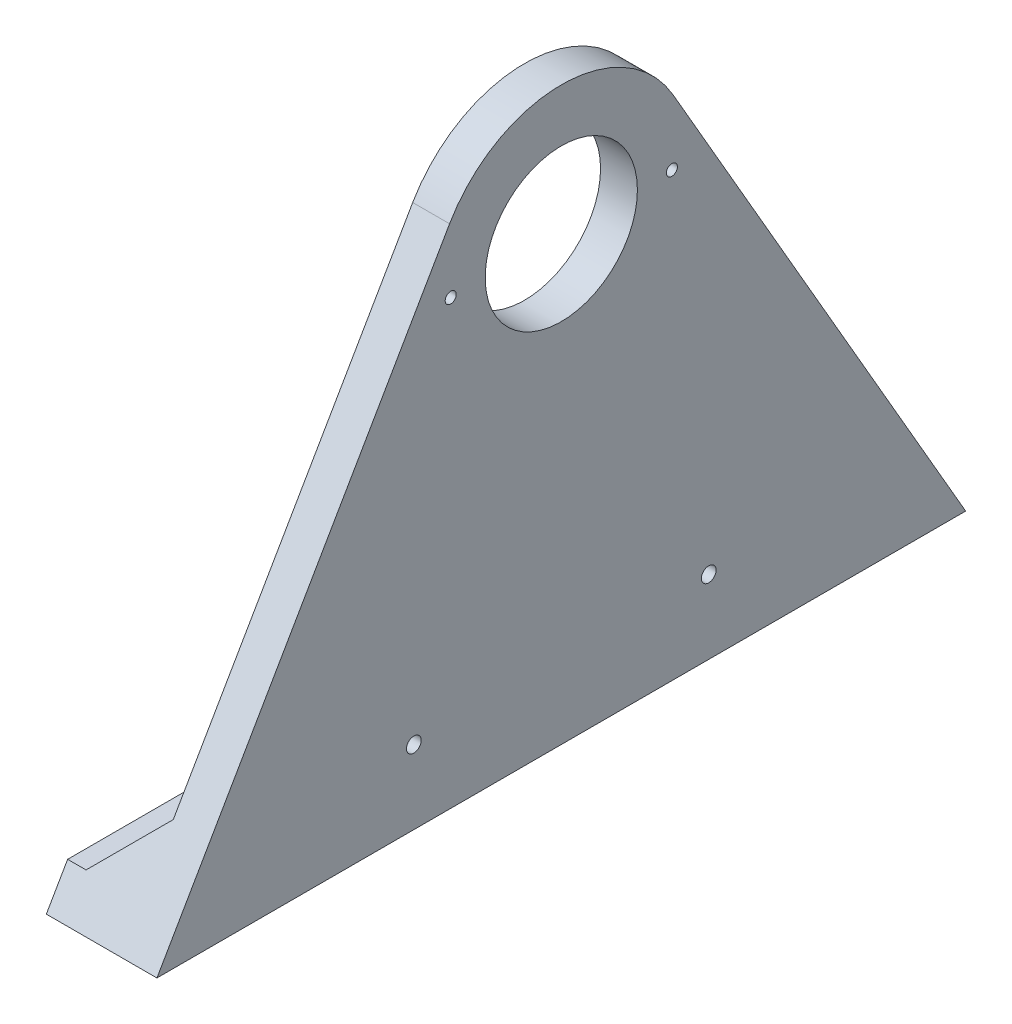
ISO-10303-21;
HEADER;
FILE_DESCRIPTION(('STEP AP214'),'2;1');
FILE_NAME('part.step','',(''),(''),'','','');
FILE_SCHEMA(('AUTOMOTIVE_DESIGN { 1 0 10303 214 1 1 1 1 }'));
ENDSEC;
DATA;
#1=APPLICATION_CONTEXT('core data for automotive mechanical design processes');
#2=APPLICATION_PROTOCOL_DEFINITION('international standard','automotive_design',2000,#1);
#3=PRODUCT_CONTEXT('',#1,'mechanical');
#4=PRODUCT('Part','Part','',(#3));
#5=PRODUCT_RELATED_PRODUCT_CATEGORY('part','',(#4));
#6=PRODUCT_DEFINITION_FORMATION('','',#4);
#7=PRODUCT_DEFINITION_CONTEXT('part definition',#1,'design');
#8=PRODUCT_DEFINITION('design','',#6,#7);
#9=PRODUCT_DEFINITION_SHAPE('','',#8);
#10=(LENGTH_UNIT() NAMED_UNIT(*) SI_UNIT(.MILLI.,.METRE.));
#11=(NAMED_UNIT(*) PLANE_ANGLE_UNIT() SI_UNIT($,.RADIAN.));
#12=(NAMED_UNIT(*) SI_UNIT($,.STERADIAN.) SOLID_ANGLE_UNIT());
#13=UNCERTAINTY_MEASURE_WITH_UNIT(LENGTH_MEASURE(1.E-05),#10,'distance_accuracy_value','');
#14=(GEOMETRIC_REPRESENTATION_CONTEXT(3) GLOBAL_UNCERTAINTY_ASSIGNED_CONTEXT((#13)) GLOBAL_UNIT_ASSIGNED_CONTEXT((#10,
#11,#12)) REPRESENTATION_CONTEXT('',''));
#15=CARTESIAN_POINT('',(0.,0.,0.));
#16=DIRECTION('',(0.,0.,1.));
#17=DIRECTION('',(1.,0.,0.));
#18=AXIS2_PLACEMENT_3D('',#15,#16,#17);
#19=CARTESIAN_POINT('',(-20.0000000000001,-110.,-103.923048454132));
#20=DIRECTION('',(-0.707106781186544,0.707106781186551,0.));
#21=DIRECTION('',(0.,0.,1.));
#22=AXIS2_PLACEMENT_3D('',#19,#20,#21);
#23=PLANE('',#22);
#24=CARTESIAN_POINT('',(-15.,-105.,-60.));
#25=DIRECTION('',(-0.707106781186544,0.707106781186551,0.));
#26=DIRECTION('',(-0.707106781186551,-0.707106781186544,0.));
#27=AXIS2_PLACEMENT_3D('',#24,#25,#26);
#28=ELLIPSE('',#27,9.19238815542508,6.5);
#29=CARTESIAN_POINT('',(-20.0000000000001,-110.,-55.8466880685411));
#30=VERTEX_POINT('',#29);
#31=CARTESIAN_POINT('',(-20.0000000000001,-110.,-64.1533119314589));
#32=VERTEX_POINT('',#31);
#33=EDGE_CURVE('E136',#30,#32,#28,.T.);
#34=ORIENTED_EDGE('',*,*,#33,.F.);
#35=DIRECTION('',(0.,0.,-1.));
#36=VECTOR('',#35,1.);
#37=CARTESIAN_POINT('',(-20.0000000000001,-110.,-103.923048454132));
#38=LINE('',#37,#36);
#39=CARTESIAN_POINT('',(-20.0000000000001,-110.,-4.15331193145893));
#40=VERTEX_POINT('',#39);
#41=EDGE_CURVE('E152',#40,#30,#38,.T.);
#42=ORIENTED_EDGE('',*,*,#41,.F.);
#43=CARTESIAN_POINT('',(-15.,-105.,0.));
#44=DIRECTION('',(-0.707106781186544,0.707106781186551,0.));
#45=DIRECTION('',(-0.707106781186551,-0.707106781186544,0.));
#46=AXIS2_PLACEMENT_3D('',#43,#44,#45);
#47=ELLIPSE('',#46,9.19238815542508,6.5);
#48=CARTESIAN_POINT('',(-20.0000000000001,-110.,4.15331193145893));
#49=VERTEX_POINT('',#48);
#50=EDGE_CURVE('E144',#49,#40,#47,.T.);
#51=ORIENTED_EDGE('',*,*,#50,.F.);
#52=CARTESIAN_POINT('',(-20.0000000000001,-110.,55.8466880685411));
#53=VERTEX_POINT('',#52);
#54=EDGE_CURVE('E167',#53,#49,#38,.T.);
#55=ORIENTED_EDGE('',*,*,#54,.F.);
#56=CARTESIAN_POINT('',(-15.,-105.,60.));
#57=DIRECTION('',(-0.707106781186544,0.707106781186551,0.));
#58=DIRECTION('',(-0.707106781186551,-0.707106781186544,0.));
#59=AXIS2_PLACEMENT_3D('',#56,#57,#58);
#60=ELLIPSE('',#59,9.19238815542508,6.5);
#61=CARTESIAN_POINT('',(-20.0000000000001,-110.,64.1533119314589));
#62=VERTEX_POINT('',#61);
#63=EDGE_CURVE('E154',#62,#53,#60,.T.);
#64=ORIENTED_EDGE('',*,*,#63,.F.);
#65=CARTESIAN_POINT('',(-20.0000000000001,-110.,103.923048454133));
#66=VERTEX_POINT('',#65);
#67=EDGE_CURVE('E163',#66,#62,#38,.T.);
#68=ORIENTED_EDGE('',*,*,#67,.F.);
#69=DIRECTION('',(0.65465367070798,0.654653670707974,-0.377964473009229));
#70=VECTOR('',#69,1.);
#71=CARTESIAN_POINT('',(63.571428571429,-26.4285714285717,55.6730616718572));
#72=LINE('',#71,#70);
#73=CARTESIAN_POINT('',(-5.,-95.,95.262794416289));
#74=VERTEX_POINT('',#73);
#75=EDGE_CURVE('E343',#74,#66,#72,.F.);
#76=ORIENTED_EDGE('',*,*,#75,.F.);
#77=DIRECTION('',(0.,0.,1.));
#78=VECTOR('',#77,1.);
#79=CARTESIAN_POINT('',(-5.,-95.0000000000001,103.923048454133));
#80=LINE('',#79,#78);
#81=CARTESIAN_POINT('',(-5.,-95.0000000000001,44.8989794855664));
#82=VERTEX_POINT('',#81);
#83=EDGE_CURVE('E174',#82,#74,#80,.T.);
#84=ORIENTED_EDGE('',*,*,#83,.F.);
#85=CARTESIAN_POINT('',(-9.99999999999999,-100.,40.));
#86=DIRECTION('',(-0.707106781186544,0.707106781186551,0.));
#87=DIRECTION('',(0.707106781186551,0.707106781186544,0.));
#88=AXIS2_PLACEMENT_3D('',#85,#86,#87);
#89=ELLIPSE('',#88,9.89949493661172,7.00000000000001);
#90=CARTESIAN_POINT('',(-5.,-95.0000000000001,35.1010205144336));
#91=VERTEX_POINT('',#90);
#92=EDGE_CURVE('E59',#91,#82,#89,.T.);
#93=ORIENTED_EDGE('',*,*,#92,.F.);
#94=CARTESIAN_POINT('',(-5.,-95.0000000000001,-35.1010205144336));
#95=VERTEX_POINT('',#94);
#96=EDGE_CURVE('E181',#95,#91,#80,.T.);
#97=ORIENTED_EDGE('',*,*,#96,.F.);
#98=CARTESIAN_POINT('',(-9.99999999999999,-100.,-40.));
#99=DIRECTION('',(-0.707106781186544,0.707106781186551,0.));
#100=DIRECTION('',(0.707106781186551,0.707106781186544,0.));
#101=AXIS2_PLACEMENT_3D('',#98,#99,#100);
#102=ELLIPSE('',#101,9.89949493661172,7.00000000000001);
#103=CARTESIAN_POINT('',(-5.,-95.0000000000001,-44.8989794855664));
#104=VERTEX_POINT('',#103);
#105=EDGE_CURVE('E12',#104,#95,#102,.T.);
#106=ORIENTED_EDGE('',*,*,#105,.F.);
#107=CARTESIAN_POINT('',(-5.,-95.0000000000001,-95.2627944162879));
#108=VERTEX_POINT('',#107);
#109=EDGE_CURVE('E182',#108,#104,#80,.T.);
#110=ORIENTED_EDGE('',*,*,#109,.F.);
#111=DIRECTION('',(-0.654653670707981,-0.654653670707975,-0.377964473009224));
#112=VECTOR('',#111,1.);
#113=CARTESIAN_POINT('',(63.5714285714286,-26.4285714285721,-55.673061671857));
#114=LINE('',#113,#112);
#115=CARTESIAN_POINT('',(-20.0000000000001,-110.,-103.923048454132));
#116=VERTEX_POINT('',#115);
#117=EDGE_CURVE('E158',#116,#108,#114,.F.);
#118=ORIENTED_EDGE('',*,*,#117,.F.);
#119=EDGE_CURVE('E150',#32,#116,#38,.T.);
#120=ORIENTED_EDGE('',*,*,#119,.F.);
#121=EDGE_LOOP('',(#34,#42,#51,#55,#64,#68,#76,#84,#93,#97,#106,#110,#118,#120));
#122=FACE_BOUND('',#121,.T.);
#123=ADVANCED_FACE('F50',(#122),#23,.T.);
#124=CARTESIAN_POINT('',(-15.,-130.,0.));
#125=DIRECTION('',(0.,1.,0.));
#126=DIRECTION('',(0.,0.,1.));
#127=AXIS2_PLACEMENT_3D('',#124,#125,#126);
#128=CYLINDRICAL_SURFACE('',#127,1.5);
#129=CARTESIAN_POINT('',(-15.,-120.,0.));
#130=DIRECTION('',(0.,1.,0.));
#131=DIRECTION('',(0.,0.,1.));
#132=AXIS2_PLACEMENT_3D('',#129,#130,#131);
#133=CIRCLE('',#132,1.5);
#134=CARTESIAN_POINT('',(-15.,-120.,1.5));
#135=VERTEX_POINT('',#134);
#136=EDGE_CURVE('E215',#135,#135,#133,.T.);
#137=ORIENTED_EDGE('',*,*,#136,.F.);
#138=EDGE_LOOP('',(#137));
#139=FACE_BOUND('',#138,.T.);
#140=CARTESIAN_POINT('',(-15.,-110.,0.));
#141=DIRECTION('',(0.,1.,0.));
#142=DIRECTION('',(0.,0.,1.));
#143=AXIS2_PLACEMENT_3D('',#140,#141,#142);
#144=CIRCLE('',#143,1.5);
#145=CARTESIAN_POINT('',(-15.,-110.,1.5));
#146=VERTEX_POINT('',#145);
#147=EDGE_CURVE('E550',#146,#146,#144,.T.);
#148=ORIENTED_EDGE('',*,*,#147,.T.);
#149=EDGE_LOOP('',(#148));
#150=FACE_BOUND('',#149,.T.);
#151=ADVANCED_FACE('F370',(#139,#150),#128,.F.);
#152=CARTESIAN_POINT('',(-15.,-130.,60.));
#153=DIRECTION('',(0.,1.,0.));
#154=DIRECTION('',(0.,0.,1.));
#155=AXIS2_PLACEMENT_3D('',#152,#153,#154);
#156=CYLINDRICAL_SURFACE('',#155,1.5);
#157=CARTESIAN_POINT('',(-15.,-120.,60.));
#158=DIRECTION('',(0.,1.,0.));
#159=DIRECTION('',(0.,0.,1.));
#160=AXIS2_PLACEMENT_3D('',#157,#158,#159);
#161=CIRCLE('',#160,1.5);
#162=CARTESIAN_POINT('',(-15.,-120.,61.5));
#163=VERTEX_POINT('',#162);
#164=EDGE_CURVE('E222',#163,#163,#161,.T.);
#165=ORIENTED_EDGE('',*,*,#164,.F.);
#166=EDGE_LOOP('',(#165));
#167=FACE_BOUND('',#166,.T.);
#168=CARTESIAN_POINT('',(-15.,-110.,60.));
#169=DIRECTION('',(0.,1.,0.));
#170=DIRECTION('',(0.,0.,1.));
#171=AXIS2_PLACEMENT_3D('',#168,#169,#170);
#172=CIRCLE('',#171,1.5);
#173=CARTESIAN_POINT('',(-15.,-110.,61.5));
#174=VERTEX_POINT('',#173);
#175=EDGE_CURVE('E544',#174,#174,#172,.T.);
#176=ORIENTED_EDGE('',*,*,#175,.T.);
#177=EDGE_LOOP('',(#176));
#178=FACE_BOUND('',#177,.T.);
#179=ADVANCED_FACE('F374',(#167,#178),#156,.F.);
#180=CARTESIAN_POINT('',(-15.,-130.,-60.));
#181=DIRECTION('',(0.,1.,0.));
#182=DIRECTION('',(0.,0.,1.));
#183=AXIS2_PLACEMENT_3D('',#180,#181,#182);
#184=CYLINDRICAL_SURFACE('',#183,1.5);
#185=CARTESIAN_POINT('',(-15.,-120.,-60.));
#186=DIRECTION('',(0.,1.,0.));
#187=DIRECTION('',(0.,0.,1.));
#188=AXIS2_PLACEMENT_3D('',#185,#186,#187);
#189=CIRCLE('',#188,1.5);
#190=CARTESIAN_POINT('',(-15.,-120.,-58.5));
#191=VERTEX_POINT('',#190);
#192=EDGE_CURVE('E226',#191,#191,#189,.T.);
#193=ORIENTED_EDGE('',*,*,#192,.F.);
#194=EDGE_LOOP('',(#193));
#195=FACE_BOUND('',#194,.T.);
#196=CARTESIAN_POINT('',(-15.,-110.,-60.));
#197=DIRECTION('',(0.,1.,0.));
#198=DIRECTION('',(0.,0.,1.));
#199=AXIS2_PLACEMENT_3D('',#196,#197,#198);
#200=CIRCLE('',#199,1.5);
#201=CARTESIAN_POINT('',(-15.,-110.,-58.5));
#202=VERTEX_POINT('',#201);
#203=EDGE_CURVE('E155',#202,#202,#200,.T.);
#204=ORIENTED_EDGE('',*,*,#203,.T.);
#205=EDGE_LOOP('',(#204));
#206=FACE_BOUND('',#205,.T.);
#207=ADVANCED_FACE('F380',(#195,#206),#184,.F.);
#208=CARTESIAN_POINT('',(-25.,-100.,-40.));
#209=DIRECTION('',(1.,0.,0.));
#210=DIRECTION('',(0.,0.,-1.));
#211=AXIS2_PLACEMENT_3D('',#208,#209,#210);
#212=CYLINDRICAL_SURFACE('',#211,2.);
#213=CARTESIAN_POINT('',(5.,-100.,-40.));
#214=DIRECTION('',(1.,0.,0.));
#215=DIRECTION('',(0.,0.,-1.));
#216=AXIS2_PLACEMENT_3D('',#213,#214,#215);
#217=CIRCLE('',#216,2.);
#218=CARTESIAN_POINT('',(5.,-100.,-42.));
#219=VERTEX_POINT('',#218);
#220=EDGE_CURVE('E204',#219,#219,#217,.T.);
#221=CARTESIAN_POINT('',(-5.,-100.,-40.));
#222=DIRECTION('',(-1.,0.,0.));
#223=DIRECTION('',(0.,0.,1.));
#224=AXIS2_PLACEMENT_3D('',#221,#222,#223);
#225=CIRCLE('',#224,2.);
#226=CARTESIAN_POINT('',(-5.,-100.,-42.));
#227=VERTEX_POINT('',#226);
#228=EDGE_CURVE('E195',#227,#227,#225,.T.);
#229=CARTESIAN_POINT('',(5.,-100.,-42.));
#230=CARTESIAN_POINT('',(4.89583333333333,-100.,-42.));
#231=CARTESIAN_POINT('',(4.79166666666667,-100.,-42.));
#232=CARTESIAN_POINT('',(4.58333333333333,-100.,-42.));
#233=CARTESIAN_POINT('',(4.47916666666667,-100.,-42.));
#234=CARTESIAN_POINT('',(4.27083333333333,-100.,-42.));
#235=CARTESIAN_POINT('',(4.16666666666667,-100.,-42.));
#236=CARTESIAN_POINT('',(3.95833333333333,-100.,-42.));
#237=CARTESIAN_POINT('',(3.85416666666667,-100.,-42.));
#238=CARTESIAN_POINT('',(3.64583333333333,-100.,-42.));
#239=CARTESIAN_POINT('',(3.54166666666667,-100.,-42.));
#240=CARTESIAN_POINT('',(3.33333333333333,-100.,-42.));
#241=CARTESIAN_POINT('',(3.22916666666667,-100.,-42.));
#242=CARTESIAN_POINT('',(3.02083333333333,-100.,-42.));
#243=CARTESIAN_POINT('',(2.91666666666667,-100.,-42.));
#244=CARTESIAN_POINT('',(2.70833333333333,-100.,-42.));
#245=CARTESIAN_POINT('',(2.60416666666667,-100.,-42.));
#246=CARTESIAN_POINT('',(2.39583333333333,-100.,-42.));
#247=CARTESIAN_POINT('',(2.29166666666667,-100.,-42.));
#248=CARTESIAN_POINT('',(2.08333333333333,-100.,-42.));
#249=CARTESIAN_POINT('',(1.97916666666667,-100.,-42.));
#250=CARTESIAN_POINT('',(1.77083333333334,-100.,-42.));
#251=CARTESIAN_POINT('',(1.66666666666667,-100.,-42.));
#252=CARTESIAN_POINT('',(1.45833333333333,-100.,-42.));
#253=CARTESIAN_POINT('',(1.35416666666667,-100.,-42.));
#254=CARTESIAN_POINT('',(1.14583333333333,-100.,-42.));
#255=CARTESIAN_POINT('',(1.04166666666667,-100.,-42.));
#256=CARTESIAN_POINT('',(0.833333333333334,-100.,-42.));
#257=CARTESIAN_POINT('',(0.729166666666667,-100.,-42.));
#258=CARTESIAN_POINT('',(0.520833333333334,-100.,-42.));
#259=CARTESIAN_POINT('',(0.416666666666667,-100.,-42.));
#260=CARTESIAN_POINT('',(0.208333333333334,-100.,-42.));
#261=CARTESIAN_POINT('',(0.104166666666667,-100.,-42.));
#262=CARTESIAN_POINT('',(-0.104166666666667,-100.,-42.));
#263=CARTESIAN_POINT('',(-0.208333333333334,-100.,-42.));
#264=CARTESIAN_POINT('',(-0.416666666666667,-100.,-42.));
#265=CARTESIAN_POINT('',(-0.520833333333334,-100.,-42.));
#266=CARTESIAN_POINT('',(-0.729166666666667,-100.,-42.));
#267=CARTESIAN_POINT('',(-0.833333333333334,-100.,-42.));
#268=CARTESIAN_POINT('',(-1.04166666666667,-100.,-42.));
#269=CARTESIAN_POINT('',(-1.14583333333333,-100.,-42.));
#270=CARTESIAN_POINT('',(-1.35416666666667,-100.,-42.));
#271=CARTESIAN_POINT('',(-1.45833333333333,-100.,-42.));
#272=CARTESIAN_POINT('',(-1.66666666666667,-100.,-42.));
#273=CARTESIAN_POINT('',(-1.77083333333333,-100.,-42.));
#274=CARTESIAN_POINT('',(-1.97916666666667,-100.,-42.));
#275=CARTESIAN_POINT('',(-2.08333333333333,-100.,-42.));
#276=CARTESIAN_POINT('',(-2.29166666666667,-100.,-42.));
#277=CARTESIAN_POINT('',(-2.39583333333333,-100.,-42.));
#278=CARTESIAN_POINT('',(-2.60416666666667,-100.,-42.));
#279=CARTESIAN_POINT('',(-2.70833333333333,-100.,-42.));
#280=CARTESIAN_POINT('',(-2.91666666666667,-100.,-42.));
#281=CARTESIAN_POINT('',(-3.02083333333333,-100.,-42.));
#282=CARTESIAN_POINT('',(-3.22916666666667,-100.,-42.));
#283=CARTESIAN_POINT('',(-3.33333333333333,-100.,-42.));
#284=CARTESIAN_POINT('',(-3.54166666666667,-100.,-42.));
#285=CARTESIAN_POINT('',(-3.64583333333333,-100.,-42.));
#286=CARTESIAN_POINT('',(-3.85416666666667,-100.,-42.));
#287=CARTESIAN_POINT('',(-3.95833333333333,-100.,-42.));
#288=CARTESIAN_POINT('',(-4.16666666666667,-100.,-42.));
#289=CARTESIAN_POINT('',(-4.27083333333333,-100.,-42.));
#290=CARTESIAN_POINT('',(-4.47916666666667,-100.,-42.));
#291=CARTESIAN_POINT('',(-4.58333333333333,-100.,-42.));
#292=CARTESIAN_POINT('',(-4.79166666666667,-100.,-42.));
#293=CARTESIAN_POINT('',(-4.89583333333333,-100.,-42.));
#294=CARTESIAN_POINT('',(-5.,-100.,-42.));
#295=B_SPLINE_CURVE_WITH_KNOTS('',3,(#229,#230,#231,#232,#233,#234,#235,#236,#237,#238,#239,
#240,#241,#242,#243,#244,#245,#246,#247,#248,#249,#250,#251,#252,#253,#254,#255,#256,#257,#258,
#259,#260,#261,#262,#263,#264,#265,#266,#267,#268,#269,#270,#271,#272,#273,#274,#275,#276,#277,
#278,#279,#280,#281,#282,#283,#284,#285,#286,#287,#288,#289,#290,#291,#292,#293,#294),
.UNSPECIFIED.,.F.,.F.,(4,2,2,2,2,2,2,2,2,2,2,2,2,2,2,2,2,2,2,2,2,2,2,2,2,2,2,2,2,2,2,2,4),(0.,
0.3125,0.625000000000001,0.937500000000001,1.25,1.5625,1.875,2.1875,2.5,2.8125,3.125,3.4375,
3.75,4.0625,4.375,4.6875,5.,5.3125,5.625,5.9375,6.25,6.5625,6.875,7.1875,7.5,7.8125,8.125,
8.4375,8.75,9.0625,9.375,9.6875,10.),.UNSPECIFIED.);
#296=EDGE_CURVE('BSEAM465',#219,#227,#295,.T.);
#297=ORIENTED_EDGE('',*,*,#220,.T.);
#298=ORIENTED_EDGE('',*,*,#228,.T.);
#299=ORIENTED_EDGE('',*,*,#296,.T.);
#300=ORIENTED_EDGE('',*,*,#296,.F.);
#301=EDGE_LOOP('',(#297,#299,#298,#300));
#302=FACE_BOUND('',#301,.T.);
#303=ADVANCED_FACE('F465',(#302),#212,.F.);
#304=CARTESIAN_POINT('',(-25.,-100.,40.));
#305=DIRECTION('',(1.,0.,0.));
#306=DIRECTION('',(0.,0.,-1.));
#307=AXIS2_PLACEMENT_3D('',#304,#305,#306);
#308=CYLINDRICAL_SURFACE('',#307,2.);
#309=CARTESIAN_POINT('',(5.,-100.,40.));
#310=DIRECTION('',(1.,0.,0.));
#311=DIRECTION('',(0.,0.,-1.));
#312=AXIS2_PLACEMENT_3D('',#309,#310,#311);
#313=CIRCLE('',#312,2.);
#314=CARTESIAN_POINT('',(5.,-100.,38.));
#315=VERTEX_POINT('',#314);
#316=EDGE_CURVE('E211',#315,#315,#313,.T.);
#317=CARTESIAN_POINT('',(-5.,-100.,40.));
#318=DIRECTION('',(-1.,0.,0.));
#319=DIRECTION('',(0.,0.,1.));
#320=AXIS2_PLACEMENT_3D('',#317,#318,#319);
#321=CIRCLE('',#320,2.);
#322=CARTESIAN_POINT('',(-5.,-100.,38.));
#323=VERTEX_POINT('',#322);
#324=EDGE_CURVE('E200',#323,#323,#321,.T.);
#325=CARTESIAN_POINT('',(5.,-100.,38.));
#326=CARTESIAN_POINT('',(4.89583333333333,-100.,38.));
#327=CARTESIAN_POINT('',(4.79166666666667,-100.,38.));
#328=CARTESIAN_POINT('',(4.58333333333333,-100.,38.));
#329=CARTESIAN_POINT('',(4.47916666666667,-100.,38.));
#330=CARTESIAN_POINT('',(4.27083333333333,-100.,38.));
#331=CARTESIAN_POINT('',(4.16666666666667,-100.,38.));
#332=CARTESIAN_POINT('',(3.95833333333333,-100.,38.));
#333=CARTESIAN_POINT('',(3.85416666666667,-100.,38.));
#334=CARTESIAN_POINT('',(3.64583333333333,-100.,38.));
#335=CARTESIAN_POINT('',(3.54166666666667,-100.,38.));
#336=CARTESIAN_POINT('',(3.33333333333333,-100.,38.));
#337=CARTESIAN_POINT('',(3.22916666666667,-100.,38.));
#338=CARTESIAN_POINT('',(3.02083333333333,-100.,38.));
#339=CARTESIAN_POINT('',(2.91666666666667,-100.,38.));
#340=CARTESIAN_POINT('',(2.70833333333333,-100.,38.));
#341=CARTESIAN_POINT('',(2.60416666666667,-100.,38.));
#342=CARTESIAN_POINT('',(2.39583333333333,-100.,38.));
#343=CARTESIAN_POINT('',(2.29166666666667,-100.,38.));
#344=CARTESIAN_POINT('',(2.08333333333333,-100.,38.));
#345=CARTESIAN_POINT('',(1.97916666666667,-100.,38.));
#346=CARTESIAN_POINT('',(1.77083333333334,-100.,38.));
#347=CARTESIAN_POINT('',(1.66666666666667,-100.,38.));
#348=CARTESIAN_POINT('',(1.45833333333333,-100.,38.));
#349=CARTESIAN_POINT('',(1.35416666666667,-100.,38.));
#350=CARTESIAN_POINT('',(1.14583333333333,-100.,38.));
#351=CARTESIAN_POINT('',(1.04166666666667,-100.,38.));
#352=CARTESIAN_POINT('',(0.833333333333334,-100.,38.));
#353=CARTESIAN_POINT('',(0.729166666666667,-100.,38.));
#354=CARTESIAN_POINT('',(0.520833333333334,-100.,38.));
#355=CARTESIAN_POINT('',(0.416666666666667,-100.,38.));
#356=CARTESIAN_POINT('',(0.208333333333334,-100.,38.));
#357=CARTESIAN_POINT('',(0.104166666666667,-100.,38.));
#358=CARTESIAN_POINT('',(-0.104166666666667,-100.,38.));
#359=CARTESIAN_POINT('',(-0.208333333333334,-100.,38.));
#360=CARTESIAN_POINT('',(-0.416666666666667,-100.,38.));
#361=CARTESIAN_POINT('',(-0.520833333333334,-100.,38.));
#362=CARTESIAN_POINT('',(-0.729166666666667,-100.,38.));
#363=CARTESIAN_POINT('',(-0.833333333333334,-100.,38.));
#364=CARTESIAN_POINT('',(-1.04166666666667,-100.,38.));
#365=CARTESIAN_POINT('',(-1.14583333333333,-100.,38.));
#366=CARTESIAN_POINT('',(-1.35416666666667,-100.,38.));
#367=CARTESIAN_POINT('',(-1.45833333333333,-100.,38.));
#368=CARTESIAN_POINT('',(-1.66666666666667,-100.,38.));
#369=CARTESIAN_POINT('',(-1.77083333333333,-100.,38.));
#370=CARTESIAN_POINT('',(-1.97916666666667,-100.,38.));
#371=CARTESIAN_POINT('',(-2.08333333333333,-100.,38.));
#372=CARTESIAN_POINT('',(-2.29166666666667,-100.,38.));
#373=CARTESIAN_POINT('',(-2.39583333333333,-100.,38.));
#374=CARTESIAN_POINT('',(-2.60416666666667,-100.,38.));
#375=CARTESIAN_POINT('',(-2.70833333333333,-100.,38.));
#376=CARTESIAN_POINT('',(-2.91666666666667,-100.,38.));
#377=CARTESIAN_POINT('',(-3.02083333333333,-100.,38.));
#378=CARTESIAN_POINT('',(-3.22916666666667,-100.,38.));
#379=CARTESIAN_POINT('',(-3.33333333333333,-100.,38.));
#380=CARTESIAN_POINT('',(-3.54166666666667,-100.,38.));
#381=CARTESIAN_POINT('',(-3.64583333333333,-100.,38.));
#382=CARTESIAN_POINT('',(-3.85416666666667,-100.,38.));
#383=CARTESIAN_POINT('',(-3.95833333333333,-100.,38.));
#384=CARTESIAN_POINT('',(-4.16666666666667,-100.,38.));
#385=CARTESIAN_POINT('',(-4.27083333333333,-100.,38.));
#386=CARTESIAN_POINT('',(-4.47916666666667,-100.,38.));
#387=CARTESIAN_POINT('',(-4.58333333333333,-100.,38.));
#388=CARTESIAN_POINT('',(-4.79166666666667,-100.,38.));
#389=CARTESIAN_POINT('',(-4.89583333333333,-100.,38.));
#390=CARTESIAN_POINT('',(-5.,-100.,38.));
#391=B_SPLINE_CURVE_WITH_KNOTS('',3,(#325,#326,#327,#328,#329,#330,#331,#332,#333,#334,#335,
#336,#337,#338,#339,#340,#341,#342,#343,#344,#345,#346,#347,#348,#349,#350,#351,#352,#353,#354,
#355,#356,#357,#358,#359,#360,#361,#362,#363,#364,#365,#366,#367,#368,#369,#370,#371,#372,#373,
#374,#375,#376,#377,#378,#379,#380,#381,#382,#383,#384,#385,#386,#387,#388,#389,#390),
.UNSPECIFIED.,.F.,.F.,(4,2,2,2,2,2,2,2,2,2,2,2,2,2,2,2,2,2,2,2,2,2,2,2,2,2,2,2,2,2,2,2,4),(0.,
0.3125,0.625000000000001,0.937500000000001,1.25,1.5625,1.875,2.1875,2.5,2.8125,3.125,3.4375,
3.75,4.0625,4.375,4.6875,5.,5.3125,5.625,5.9375,6.25,6.5625,6.875,7.1875,7.5,7.8125,8.125,
8.4375,8.75,9.0625,9.375,9.6875,10.),.UNSPECIFIED.);
#392=EDGE_CURVE('BSEAM408',#315,#323,#391,.T.);
#393=ORIENTED_EDGE('',*,*,#316,.T.);
#394=ORIENTED_EDGE('',*,*,#324,.T.);
#395=ORIENTED_EDGE('',*,*,#392,.T.);
#396=ORIENTED_EDGE('',*,*,#392,.F.);
#397=EDGE_LOOP('',(#393,#395,#394,#396));
#398=FACE_BOUND('',#397,.T.);
#399=ADVANCED_FACE('F408',(#398),#308,.F.);
#400=CARTESIAN_POINT('',(-5.,0.,0.));
#401=DIRECTION('',(1.,0.,0.));
#402=DIRECTION('',(0.,0.,-1.));
#403=AXIS2_PLACEMENT_3D('',#400,#401,#402);
#404=PLANE('',#403);
#405=ORIENTED_EDGE('',*,*,#109,.T.);
#406=CARTESIAN_POINT('',(-5.,-100.,-40.));
#407=DIRECTION('',(-1.,0.,0.));
#408=DIRECTION('',(0.,0.,1.));
#409=AXIS2_PLACEMENT_3D('',#406,#407,#408);
#410=CIRCLE('',#409,7.00000000000001);
#411=EDGE_CURVE('E199',#104,#95,#410,.T.);
#412=ORIENTED_EDGE('',*,*,#411,.T.);
#413=ORIENTED_EDGE('',*,*,#96,.T.);
#414=CARTESIAN_POINT('',(-5.,-100.,40.));
#415=DIRECTION('',(-1.,0.,0.));
#416=DIRECTION('',(0.,0.,1.));
#417=AXIS2_PLACEMENT_3D('',#414,#415,#416);
#418=CIRCLE('',#417,7.00000000000001);
#419=EDGE_CURVE('E143',#91,#82,#418,.T.);
#420=ORIENTED_EDGE('',*,*,#419,.T.);
#421=ORIENTED_EDGE('',*,*,#83,.T.);
#422=DIRECTION('',(0.,-0.866025403784436,0.500000000000004));
#423=VECTOR('',#422,1.);
#424=CARTESIAN_POINT('',(-5.,17.5000000000001,30.3108891324553));
#425=LINE('',#424,#423);
#426=CARTESIAN_POINT('',(-5.,17.5000000000001,30.3108891324553));
#427=VERTEX_POINT('',#426);
#428=EDGE_CURVE('E293',#427,#74,#425,.T.);
#429=ORIENTED_EDGE('',*,*,#428,.F.);
#430=CARTESIAN_POINT('',(-5.,0.,0.));
#431=DIRECTION('',(1.,0.,0.));
#432=DIRECTION('',(0.,0.,-1.));
#433=AXIS2_PLACEMENT_3D('',#430,#431,#432);
#434=CIRCLE('',#433,35.);
#435=CARTESIAN_POINT('',(-5.,17.4999999999999,-30.3108891324554));
#436=VERTEX_POINT('',#435);
#437=EDGE_CURVE('E271',#436,#427,#434,.T.);
#438=ORIENTED_EDGE('',*,*,#437,.F.);
#439=DIRECTION('',(0.,0.86602540378444,0.499999999999998));
#440=VECTOR('',#439,1.);
#441=CARTESIAN_POINT('',(-5.,17.4999999999999,-30.3108891324554));
#442=LINE('',#441,#440);
#443=EDGE_CURVE('E280',#108,#436,#442,.T.);
#444=ORIENTED_EDGE('',*,*,#443,.F.);
#445=EDGE_LOOP('',(#405,#412,#413,#420,#421,#429,#438,#444));
#446=FACE_BOUND('',#445,.T.);
#447=CARTESIAN_POINT('',(-5.,0.,-30.));
#448=DIRECTION('',(1.,0.,0.));
#449=DIRECTION('',(0.,0.,-1.));
#450=AXIS2_PLACEMENT_3D('',#447,#448,#449);
#451=CIRCLE('',#450,1.5);
#452=CARTESIAN_POINT('',(-5.,0.,-31.5));
#453=VERTEX_POINT('',#452);
#454=EDGE_CURVE('E250',#453,#453,#451,.T.);
#455=ORIENTED_EDGE('',*,*,#454,.T.);
#456=EDGE_LOOP('',(#455));
#457=FACE_BOUND('',#456,.T.);
#458=CARTESIAN_POINT('',(-5.,-2.4958714251482E-13,30.));
#459=DIRECTION('',(1.,0.,0.));
#460=DIRECTION('',(0.,0.,-1.));
#461=AXIS2_PLACEMENT_3D('',#458,#459,#460);
#462=CIRCLE('',#461,1.5);
#463=CARTESIAN_POINT('',(-5.,-2.4958714251482E-13,28.5));
#464=VERTEX_POINT('',#463);
#465=EDGE_CURVE('E255',#464,#464,#462,.T.);
#466=ORIENTED_EDGE('',*,*,#465,.T.);
#467=EDGE_LOOP('',(#466));
#468=FACE_BOUND('',#467,.T.);
#469=CARTESIAN_POINT('',(-5.,0.,0.));
#470=DIRECTION('',(1.,0.,0.));
#471=DIRECTION('',(0.,0.,-1.));
#472=AXIS2_PLACEMENT_3D('',#469,#470,#471);
#473=CIRCLE('',#472,20.65);
#474=CARTESIAN_POINT('',(-5.,0.,-20.65));
#475=VERTEX_POINT('',#474);
#476=EDGE_CURVE('E263',#475,#475,#473,.T.);
#477=ORIENTED_EDGE('',*,*,#476,.T.);
#478=EDGE_LOOP('',(#477));
#479=FACE_BOUND('',#478,.T.);
#480=ORIENTED_EDGE('',*,*,#324,.F.);
#481=EDGE_LOOP('',(#480));
#482=FACE_BOUND('',#481,.T.);
#483=ORIENTED_EDGE('',*,*,#228,.F.);
#484=EDGE_LOOP('',(#483));
#485=FACE_BOUND('',#484,.T.);
#486=ADVANCED_FACE('F337',(#446,#457,#468,#479,#482,#485),#404,.F.);
#487=CARTESIAN_POINT('',(5.,0.,0.));
#488=DIRECTION('',(1.,0.,0.));
#489=DIRECTION('',(0.,0.,-1.));
#490=AXIS2_PLACEMENT_3D('',#487,#488,#489);
#491=PLANE('',#490);
#492=ORIENTED_EDGE('',*,*,#316,.F.);
#493=EDGE_LOOP('',(#492));
#494=FACE_BOUND('',#493,.T.);
#495=ORIENTED_EDGE('',*,*,#220,.F.);
#496=EDGE_LOOP('',(#495));
#497=FACE_BOUND('',#496,.T.);
#498=CARTESIAN_POINT('',(5.,-2.4958714251482E-13,30.));
#499=DIRECTION('',(1.,0.,0.));
#500=DIRECTION('',(0.,0.,-1.));
#501=AXIS2_PLACEMENT_3D('',#498,#499,#500);
#502=CIRCLE('',#501,1.5);
#503=CARTESIAN_POINT('',(5.,-2.4958714251482E-13,28.5));
#504=VERTEX_POINT('',#503);
#505=EDGE_CURVE('E259',#504,#504,#502,.T.);
#506=ORIENTED_EDGE('',*,*,#505,.F.);
#507=EDGE_LOOP('',(#506));
#508=FACE_BOUND('',#507,.T.);
#509=CARTESIAN_POINT('',(5.,0.,0.));
#510=DIRECTION('',(1.,0.,0.));
#511=DIRECTION('',(0.,0.,-1.));
#512=AXIS2_PLACEMENT_3D('',#509,#510,#511);
#513=CIRCLE('',#512,35.);
#514=CARTESIAN_POINT('',(5.,17.4999999999999,-30.3108891324554));
#515=VERTEX_POINT('',#514);
#516=CARTESIAN_POINT('',(5.,17.5000000000001,30.3108891324553));
#517=VERTEX_POINT('',#516);
#518=EDGE_CURVE('E275',#515,#517,#513,.T.);
#519=ORIENTED_EDGE('',*,*,#518,.T.);
#520=DIRECTION('',(0.,-0.866025403784436,0.500000000000004));
#521=VECTOR('',#520,1.);
#522=CARTESIAN_POINT('',(5.,17.5000000000001,30.3108891324553));
#523=LINE('',#522,#521);
#524=CARTESIAN_POINT('',(5.,-120.,109.69655114603));
#525=VERTEX_POINT('',#524);
#526=EDGE_CURVE('E279',#517,#525,#523,.T.);
#527=ORIENTED_EDGE('',*,*,#526,.T.);
#528=DIRECTION('',(0.,0.,-1.));
#529=VECTOR('',#528,1.);
#530=CARTESIAN_POINT('',(5.,-120.,109.69655114603));
#531=LINE('',#530,#529);
#532=CARTESIAN_POINT('',(5.,-120.,-109.696551146028));
#533=VERTEX_POINT('',#532);
#534=EDGE_CURVE('E283',#525,#533,#531,.T.);
#535=ORIENTED_EDGE('',*,*,#534,.T.);
#536=DIRECTION('',(0.,0.86602540378444,0.499999999999998));
#537=VECTOR('',#536,1.);
#538=CARTESIAN_POINT('',(5.,17.4999999999999,-30.3108891324554));
#539=LINE('',#538,#537);
#540=EDGE_CURVE('E286',#533,#515,#539,.T.);
#541=ORIENTED_EDGE('',*,*,#540,.T.);
#542=EDGE_LOOP('',(#519,#527,#535,#541));
#543=FACE_BOUND('',#542,.T.);
#544=CARTESIAN_POINT('',(5.,0.,0.));
#545=DIRECTION('',(1.,0.,0.));
#546=DIRECTION('',(0.,0.,-1.));
#547=AXIS2_PLACEMENT_3D('',#544,#545,#546);
#548=CIRCLE('',#547,20.65);
#549=CARTESIAN_POINT('',(5.,0.,-20.65));
#550=VERTEX_POINT('',#549);
#551=EDGE_CURVE('E267',#550,#550,#548,.T.);
#552=ORIENTED_EDGE('',*,*,#551,.F.);
#553=EDGE_LOOP('',(#552));
#554=FACE_BOUND('',#553,.T.);
#555=CARTESIAN_POINT('',(5.,0.,-30.));
#556=DIRECTION('',(1.,0.,0.));
#557=DIRECTION('',(0.,0.,-1.));
#558=AXIS2_PLACEMENT_3D('',#555,#556,#557);
#559=CIRCLE('',#558,1.5);
#560=CARTESIAN_POINT('',(5.,0.,-31.5));
#561=VERTEX_POINT('',#560);
#562=EDGE_CURVE('E251',#561,#561,#559,.T.);
#563=ORIENTED_EDGE('',*,*,#562,.F.);
#564=EDGE_LOOP('',(#563));
#565=FACE_BOUND('',#564,.T.);
#566=ADVANCED_FACE('F327',(#494,#497,#508,#543,#554,#565),#491,.T.);
#567=CARTESIAN_POINT('',(5.,0.,0.));
#568=DIRECTION('',(-1.,0.,0.));
#569=DIRECTION('',(0.,0.,1.));
#570=AXIS2_PLACEMENT_3D('',#567,#568,#569);
#571=CYLINDRICAL_SURFACE('',#570,35.);
#572=ORIENTED_EDGE('',*,*,#437,.T.);
#573=DIRECTION('',(-1.,0.,0.));
#574=VECTOR('',#573,1.);
#575=CARTESIAN_POINT('',(5.,17.5000000000001,30.3108891324553));
#576=LINE('',#575,#574);
#577=EDGE_CURVE('E161',#517,#427,#576,.T.);
#578=ORIENTED_EDGE('',*,*,#577,.F.);
#579=ORIENTED_EDGE('',*,*,#518,.F.);
#580=DIRECTION('',(-1.,0.,0.));
#581=VECTOR('',#580,1.);
#582=CARTESIAN_POINT('',(5.,17.4999999999999,-30.3108891324554));
#583=LINE('',#582,#581);
#584=EDGE_CURVE('E289',#515,#436,#583,.T.);
#585=ORIENTED_EDGE('',*,*,#584,.T.);
#586=EDGE_LOOP('',(#572,#578,#579,#585));
#587=FACE_BOUND('',#586,.T.);
#588=ADVANCED_FACE('F333',(#587),#571,.T.);
#589=CARTESIAN_POINT('',(5.,17.5000000000001,30.3108891324553));
#590=DIRECTION('',(0.,-0.500000000000004,-0.866025403784436));
#591=DIRECTION('',(0.,0.866025403784436,-0.500000000000004));
#592=AXIS2_PLACEMENT_3D('',#589,#590,#591);
#593=PLANE('',#592);
#594=ORIENTED_EDGE('',*,*,#428,.T.);
#595=ORIENTED_EDGE('',*,*,#75,.T.);
#596=DIRECTION('',(1.,0.,0.));
#597=VECTOR('',#596,1.);
#598=CARTESIAN_POINT('',(-25.,-110.,103.923048454133));
#599=LINE('',#598,#597);
#600=CARTESIAN_POINT('',(-25.,-110.,103.923048454133));
#601=VERTEX_POINT('',#600);
#602=EDGE_CURVE('E247',#601,#66,#599,.T.);
#603=ORIENTED_EDGE('',*,*,#602,.F.);
#604=DIRECTION('',(0.,0.866025403784407,-0.500000000000055));
#605=VECTOR('',#604,1.);
#606=CARTESIAN_POINT('',(-25.,-110.,103.923048454133));
#607=LINE('',#606,#605);
#608=CARTESIAN_POINT('',(-25.,-120.,109.69655114603));
#609=VERTEX_POINT('',#608);
#610=EDGE_CURVE('E234',#609,#601,#607,.T.);
#611=ORIENTED_EDGE('',*,*,#610,.F.);
#612=DIRECTION('',(-1.,0.,0.));
#613=VECTOR('',#612,1.);
#614=CARTESIAN_POINT('',(5.,-120.,109.69655114603));
#615=LINE('',#614,#613);
#616=EDGE_CURVE('E169',#525,#609,#615,.T.);
#617=ORIENTED_EDGE('',*,*,#616,.F.);
#618=ORIENTED_EDGE('',*,*,#526,.F.);
#619=ORIENTED_EDGE('',*,*,#577,.T.);
#620=EDGE_LOOP('',(#594,#595,#603,#611,#617,#618,#619));
#621=FACE_BOUND('',#620,.T.);
#622=ADVANCED_FACE('F316',(#621),#593,.F.);
#623=CARTESIAN_POINT('',(5.,-120.,109.69655114603));
#624=DIRECTION('',(0.,1.,0.));
#625=DIRECTION('',(0.,0.,1.));
#626=AXIS2_PLACEMENT_3D('',#623,#624,#625);
#627=PLANE('',#626);
#628=ORIENTED_EDGE('',*,*,#192,.T.);
#629=EDGE_LOOP('',(#628));
#630=FACE_BOUND('',#629,.T.);
#631=ORIENTED_EDGE('',*,*,#164,.T.);
#632=EDGE_LOOP('',(#631));
#633=FACE_BOUND('',#632,.T.);
#634=ORIENTED_EDGE('',*,*,#136,.T.);
#635=EDGE_LOOP('',(#634));
#636=FACE_BOUND('',#635,.T.);
#637=ORIENTED_EDGE('',*,*,#616,.T.);
#638=DIRECTION('',(0.,0.,1.));
#639=VECTOR('',#638,1.);
#640=CARTESIAN_POINT('',(-25.,-120.,109.69655114603));
#641=LINE('',#640,#639);
#642=CARTESIAN_POINT('',(-25.,-120.,-109.696551146028));
#643=VERTEX_POINT('',#642);
#644=EDGE_CURVE('E230',#643,#609,#641,.T.);
#645=ORIENTED_EDGE('',*,*,#644,.F.);
#646=DIRECTION('',(-1.,0.,0.));
#647=VECTOR('',#646,1.);
#648=CARTESIAN_POINT('',(5.,-120.,-109.696551146028));
#649=LINE('',#648,#647);
#650=EDGE_CURVE('E302',#533,#643,#649,.T.);
#651=ORIENTED_EDGE('',*,*,#650,.F.);
#652=ORIENTED_EDGE('',*,*,#534,.F.);
#653=EDGE_LOOP('',(#637,#645,#651,#652));
#654=FACE_BOUND('',#653,.T.);
#655=ADVANCED_FACE('F312',(#630,#633,#636,#654),#627,.F.);
#656=CARTESIAN_POINT('',(5.,17.4999999999999,-30.3108891324554));
#657=DIRECTION('',(0.,-0.499999999999998,0.86602540378444));
#658=DIRECTION('',(0.,-0.86602540378444,-0.499999999999998));
#659=AXIS2_PLACEMENT_3D('',#656,#657,#658);
#660=PLANE('',#659);
#661=ORIENTED_EDGE('',*,*,#650,.T.);
#662=DIRECTION('',(0.,-0.866025403784439,-0.5));
#663=VECTOR('',#662,1.);
#664=CARTESIAN_POINT('',(-25.,-120.,-109.696551146028));
#665=LINE('',#664,#663);
#666=CARTESIAN_POINT('',(-25.,-110.,-103.923048454132));
#667=VERTEX_POINT('',#666);
#668=EDGE_CURVE('E240',#667,#643,#665,.T.);
#669=ORIENTED_EDGE('',*,*,#668,.F.);
#670=DIRECTION('',(1.,0.,0.));
#671=VECTOR('',#670,1.);
#672=CARTESIAN_POINT('',(-25.,-110.,-103.923048454132));
#673=LINE('',#672,#671);
#674=EDGE_CURVE('E244',#667,#116,#673,.T.);
#675=ORIENTED_EDGE('',*,*,#674,.T.);
#676=ORIENTED_EDGE('',*,*,#117,.T.);
#677=ORIENTED_EDGE('',*,*,#443,.T.);
#678=ORIENTED_EDGE('',*,*,#584,.F.);
#679=ORIENTED_EDGE('',*,*,#540,.F.);
#680=EDGE_LOOP('',(#661,#669,#675,#676,#677,#678,#679));
#681=FACE_BOUND('',#680,.T.);
#682=ADVANCED_FACE('F322',(#681),#660,.F.);
#683=CARTESIAN_POINT('',(5.,0.,0.));
#684=DIRECTION('',(-1.,0.,0.));
#685=DIRECTION('',(0.,0.,1.));
#686=AXIS2_PLACEMENT_3D('',#683,#684,#685);
#687=CYLINDRICAL_SURFACE('',#686,20.65);
#688=ORIENTED_EDGE('',*,*,#551,.T.);
#689=EDGE_LOOP('',(#688));
#690=FACE_BOUND('',#689,.T.);
#691=ORIENTED_EDGE('',*,*,#476,.F.);
#692=EDGE_LOOP('',(#691));
#693=FACE_BOUND('',#692,.T.);
#694=ADVANCED_FACE('F398',(#690,#693),#687,.F.);
#695=CARTESIAN_POINT('',(5.,-2.4958714251482E-13,30.));
#696=DIRECTION('',(-1.,0.,0.));
#697=DIRECTION('',(0.,0.,1.));
#698=AXIS2_PLACEMENT_3D('',#695,#696,#697);
#699=CYLINDRICAL_SURFACE('',#698,1.5);
#700=ORIENTED_EDGE('',*,*,#505,.T.);
#701=EDGE_LOOP('',(#700));
#702=FACE_BOUND('',#701,.T.);
#703=ORIENTED_EDGE('',*,*,#465,.F.);
#704=EDGE_LOOP('',(#703));
#705=FACE_BOUND('',#704,.T.);
#706=ADVANCED_FACE('F394',(#702,#705),#699,.F.);
#707=CARTESIAN_POINT('',(5.,0.,-30.));
#708=DIRECTION('',(-1.,0.,0.));
#709=DIRECTION('',(0.,0.,1.));
#710=AXIS2_PLACEMENT_3D('',#707,#708,#709);
#711=CYLINDRICAL_SURFACE('',#710,1.5);
#712=ORIENTED_EDGE('',*,*,#562,.T.);
#713=EDGE_LOOP('',(#712));
#714=FACE_BOUND('',#713,.T.);
#715=ORIENTED_EDGE('',*,*,#454,.F.);
#716=EDGE_LOOP('',(#715));
#717=FACE_BOUND('',#716,.T.);
#718=ADVANCED_FACE('F391',(#714,#717),#711,.F.);
#719=CARTESIAN_POINT('',(-25.,-110.,-103.923048454132));
#720=DIRECTION('',(0.,-1.,0.));
#721=DIRECTION('',(0.,0.,-1.));
#722=AXIS2_PLACEMENT_3D('',#719,#720,#721);
#723=PLANE('',#722);
#724=ORIENTED_EDGE('',*,*,#41,.T.);
#725=CARTESIAN_POINT('',(-15.,-110.,-60.));
#726=DIRECTION('',(0.,1.,0.));
#727=DIRECTION('',(0.,0.,1.));
#728=AXIS2_PLACEMENT_3D('',#725,#726,#727);
#729=CIRCLE('',#728,6.5);
#730=EDGE_CURVE('E65',#30,#32,#729,.T.);
#731=ORIENTED_EDGE('',*,*,#730,.T.);
#732=ORIENTED_EDGE('',*,*,#119,.T.);
#733=ORIENTED_EDGE('',*,*,#674,.F.);
#734=DIRECTION('',(0.,0.,-1.));
#735=VECTOR('',#734,1.);
#736=CARTESIAN_POINT('',(-25.,-110.,-103.923048454132));
#737=LINE('',#736,#735);
#738=EDGE_CURVE('E237',#601,#667,#737,.T.);
#739=ORIENTED_EDGE('',*,*,#738,.F.);
#740=ORIENTED_EDGE('',*,*,#602,.T.);
#741=ORIENTED_EDGE('',*,*,#67,.T.);
#742=CARTESIAN_POINT('',(-15.,-110.,60.));
#743=DIRECTION('',(0.,1.,0.));
#744=DIRECTION('',(0.,0.,1.));
#745=AXIS2_PLACEMENT_3D('',#742,#743,#744);
#746=CIRCLE('',#745,6.5);
#747=EDGE_CURVE('E186',#62,#53,#746,.T.);
#748=ORIENTED_EDGE('',*,*,#747,.T.);
#749=ORIENTED_EDGE('',*,*,#54,.T.);
#750=CARTESIAN_POINT('',(-15.,-110.,0.));
#751=DIRECTION('',(0.,1.,0.));
#752=DIRECTION('',(0.,0.,1.));
#753=AXIS2_PLACEMENT_3D('',#750,#751,#752);
#754=CIRCLE('',#753,6.5);
#755=EDGE_CURVE('E72',#49,#40,#754,.T.);
#756=ORIENTED_EDGE('',*,*,#755,.T.);
#757=EDGE_LOOP('',(#724,#731,#732,#733,#739,#740,#741,#748,#749,#756));
#758=FACE_BOUND('',#757,.T.);
#759=ORIENTED_EDGE('',*,*,#175,.F.);
#760=EDGE_LOOP('',(#759));
#761=FACE_BOUND('',#760,.T.);
#762=ORIENTED_EDGE('',*,*,#147,.F.);
#763=EDGE_LOOP('',(#762));
#764=FACE_BOUND('',#763,.T.);
#765=ORIENTED_EDGE('',*,*,#203,.F.);
#766=EDGE_LOOP('',(#765));
#767=FACE_BOUND('',#766,.T.);
#768=ADVANCED_FACE('F147',(#758,#761,#764,#767),#723,.F.);
#769=CARTESIAN_POINT('',(-25.,0.,0.));
#770=DIRECTION('',(1.,0.,0.));
#771=DIRECTION('',(0.,0.,-1.));
#772=AXIS2_PLACEMENT_3D('',#769,#770,#771);
#773=PLANE('',#772);
#774=ORIENTED_EDGE('',*,*,#644,.T.);
#775=ORIENTED_EDGE('',*,*,#610,.T.);
#776=ORIENTED_EDGE('',*,*,#738,.T.);
#777=ORIENTED_EDGE('',*,*,#668,.T.);
#778=EDGE_LOOP('',(#774,#775,#776,#777));
#779=FACE_BOUND('',#778,.T.);
#780=ADVANCED_FACE('F319',(#779),#773,.F.);
#781=CARTESIAN_POINT('',(-35.,-100.,40.));
#782=DIRECTION('',(1.,0.,0.));
#783=DIRECTION('',(0.,0.,-1.));
#784=AXIS2_PLACEMENT_3D('',#781,#782,#783);
#785=CYLINDRICAL_SURFACE('',#784,7.00000000000001);
#786=ORIENTED_EDGE('',*,*,#92,.T.);
#787=ORIENTED_EDGE('',*,*,#419,.F.);
#788=EDGE_LOOP('',(#786,#787));
#789=FACE_BOUND('',#788,.T.);
#790=ADVANCED_FACE('F358',(#789),#785,.F.);
#791=CARTESIAN_POINT('',(-35.,-100.,-40.));
#792=DIRECTION('',(1.,0.,0.));
#793=DIRECTION('',(0.,0.,-1.));
#794=AXIS2_PLACEMENT_3D('',#791,#792,#793);
#795=CYLINDRICAL_SURFACE('',#794,7.00000000000001);
#796=ORIENTED_EDGE('',*,*,#105,.T.);
#797=ORIENTED_EDGE('',*,*,#411,.F.);
#798=EDGE_LOOP('',(#796,#797));
#799=FACE_BOUND('',#798,.T.);
#800=ADVANCED_FACE('F356',(#799),#795,.F.);
#801=CARTESIAN_POINT('',(-15.,-80.,-60.));
#802=DIRECTION('',(0.,-1.,0.));
#803=DIRECTION('',(0.,0.,-1.));
#804=AXIS2_PLACEMENT_3D('',#801,#802,#803);
#805=CYLINDRICAL_SURFACE('',#804,6.5);
#806=ORIENTED_EDGE('',*,*,#33,.T.);
#807=ORIENTED_EDGE('',*,*,#730,.F.);
#808=EDGE_LOOP('',(#806,#807));
#809=FACE_BOUND('',#808,.T.);
#810=ADVANCED_FACE('F137',(#809),#805,.F.);
#811=CARTESIAN_POINT('',(-15.,-80.,60.));
#812=DIRECTION('',(0.,-1.,0.));
#813=DIRECTION('',(0.,0.,-1.));
#814=AXIS2_PLACEMENT_3D('',#811,#812,#813);
#815=CYLINDRICAL_SURFACE('',#814,6.5);
#816=ORIENTED_EDGE('',*,*,#63,.T.);
#817=ORIENTED_EDGE('',*,*,#747,.F.);
#818=EDGE_LOOP('',(#816,#817));
#819=FACE_BOUND('',#818,.T.);
#820=ADVANCED_FACE('F365',(#819),#815,.F.);
#821=CARTESIAN_POINT('',(-15.,-80.,0.));
#822=DIRECTION('',(0.,-1.,0.));
#823=DIRECTION('',(0.,0.,-1.));
#824=AXIS2_PLACEMENT_3D('',#821,#822,#823);
#825=CYLINDRICAL_SURFACE('',#824,6.5);
#826=ORIENTED_EDGE('',*,*,#50,.T.);
#827=ORIENTED_EDGE('',*,*,#755,.F.);
#828=EDGE_LOOP('',(#826,#827));
#829=FACE_BOUND('',#828,.T.);
#830=ADVANCED_FACE('F532',(#829),#825,.F.);
#831=CLOSED_SHELL('',(#123,#151,#179,#207,#303,#399,#486,#566,#588,#622,#655,#682,#694,#706,
#718,#768,#780,#790,#800,#810,#820,#830));
#832=MANIFOLD_SOLID_BREP('B2',#831);
#833=ADVANCED_BREP_SHAPE_REPRESENTATION('',(#18,#832),#14);
#834=SHAPE_DEFINITION_REPRESENTATION(#9,#833);
ENDSEC;
END-ISO-10303-21;
